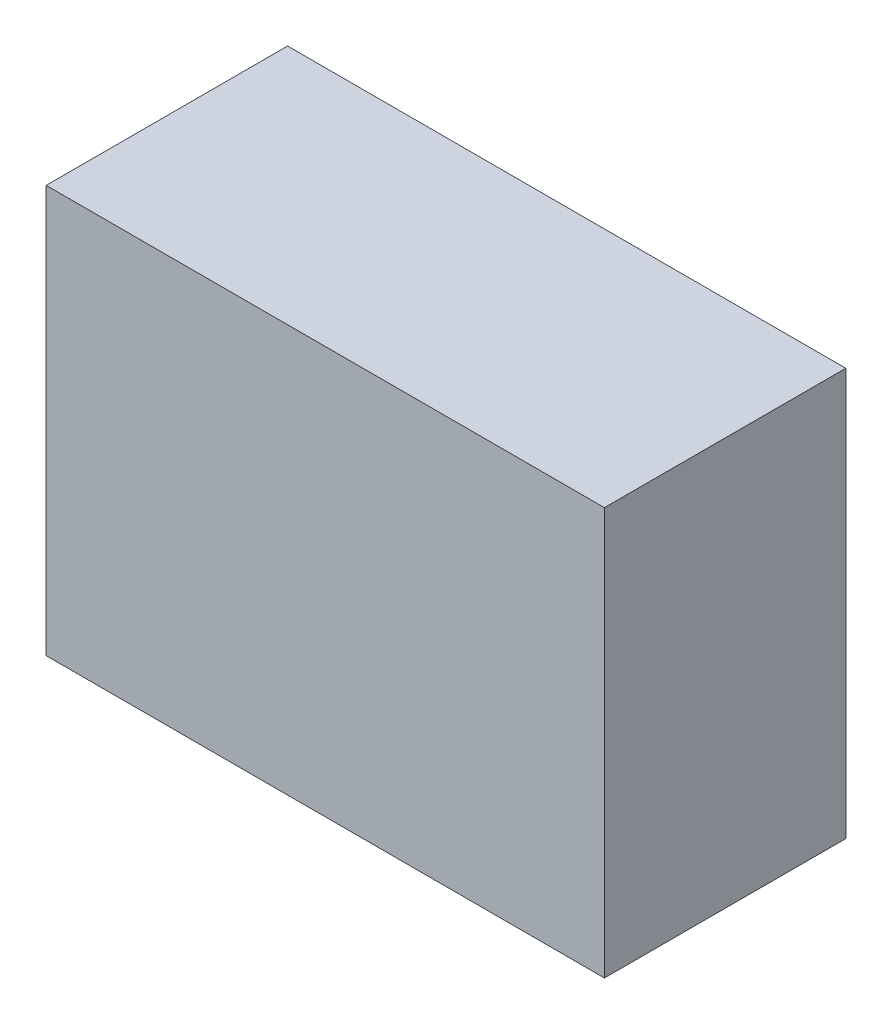
ISO-10303-21;
HEADER;
FILE_DESCRIPTION(('STEP AP214'),'2;1');
FILE_NAME('part.step','',(''),(''),'','','');
FILE_SCHEMA(('AUTOMOTIVE_DESIGN { 1 0 10303 214 1 1 1 1 }'));
ENDSEC;
DATA;
#1=APPLICATION_CONTEXT('core data for automotive mechanical design processes');
#2=APPLICATION_PROTOCOL_DEFINITION('international standard','automotive_design',2000,#1);
#3=PRODUCT_CONTEXT('',#1,'mechanical');
#4=PRODUCT('Part','Part','',(#3));
#5=PRODUCT_RELATED_PRODUCT_CATEGORY('part','',(#4));
#6=PRODUCT_DEFINITION_FORMATION('','',#4);
#7=PRODUCT_DEFINITION_CONTEXT('part definition',#1,'design');
#8=PRODUCT_DEFINITION('design','',#6,#7);
#9=PRODUCT_DEFINITION_SHAPE('','',#8);
#10=(LENGTH_UNIT() NAMED_UNIT(*) SI_UNIT(.MILLI.,.METRE.));
#11=(NAMED_UNIT(*) PLANE_ANGLE_UNIT() SI_UNIT($,.RADIAN.));
#12=(NAMED_UNIT(*) SI_UNIT($,.STERADIAN.) SOLID_ANGLE_UNIT());
#13=UNCERTAINTY_MEASURE_WITH_UNIT(LENGTH_MEASURE(1.E-05),#10,'distance_accuracy_value','');
#14=(GEOMETRIC_REPRESENTATION_CONTEXT(3) GLOBAL_UNCERTAINTY_ASSIGNED_CONTEXT((#13)) GLOBAL_UNIT_ASSIGNED_CONTEXT((#10,
#11,#12)) REPRESENTATION_CONTEXT('',''));
#15=CARTESIAN_POINT('',(0.,0.,0.));
#16=DIRECTION('',(0.,0.,1.));
#17=DIRECTION('',(1.,0.,0.));
#18=AXIS2_PLACEMENT_3D('',#15,#16,#17);
#19=CARTESIAN_POINT('',(0.,0.,16.));
#20=DIRECTION('',(1.,0.,0.));
#21=DIRECTION('',(0.,0.,-1.));
#22=AXIS2_PLACEMENT_3D('',#19,#20,#21);
#23=PLANE('',#22);
#24=DIRECTION('',(0.,-1.,0.));
#25=VECTOR('',#24,1.);
#26=CARTESIAN_POINT('',(0.,0.,0.));
#27=LINE('',#26,#25);
#28=CARTESIAN_POINT('',(0.,27.,0.));
#29=VERTEX_POINT('',#28);
#30=CARTESIAN_POINT('',(0.,0.,0.));
#31=VERTEX_POINT('',#30);
#32=EDGE_CURVE('E105',#29,#31,#27,.T.);
#33=ORIENTED_EDGE('',*,*,#32,.T.);
#34=DIRECTION('',(0.,0.,-1.));
#35=VECTOR('',#34,1.);
#36=CARTESIAN_POINT('',(0.,0.,16.));
#37=LINE('',#36,#35);
#38=CARTESIAN_POINT('',(0.,0.,16.));
#39=VERTEX_POINT('',#38);
#40=EDGE_CURVE('E11',#39,#31,#37,.T.);
#41=ORIENTED_EDGE('',*,*,#40,.F.);
#42=DIRECTION('',(0.,-1.,0.));
#43=VECTOR('',#42,1.);
#44=CARTESIAN_POINT('',(0.,0.,16.));
#45=LINE('',#44,#43);
#46=CARTESIAN_POINT('',(0.,27.,16.));
#47=VERTEX_POINT('',#46);
#48=EDGE_CURVE('E89',#47,#39,#45,.T.);
#49=ORIENTED_EDGE('',*,*,#48,.F.);
#50=DIRECTION('',(0.,0.,-1.));
#51=VECTOR('',#50,1.);
#52=CARTESIAN_POINT('',(0.,27.,16.));
#53=LINE('',#52,#51);
#54=EDGE_CURVE('E97',#47,#29,#53,.T.);
#55=ORIENTED_EDGE('',*,*,#54,.T.);
#56=EDGE_LOOP('',(#33,#41,#49,#55));
#57=FACE_BOUND('',#56,.T.);
#58=ADVANCED_FACE('F39',(#57),#23,.F.);
#59=CARTESIAN_POINT('',(0.,0.,16.));
#60=DIRECTION('',(0.,1.,0.));
#61=DIRECTION('',(0.,0.,1.));
#62=AXIS2_PLACEMENT_3D('',#59,#60,#61);
#63=PLANE('',#62);
#64=DIRECTION('',(1.,0.,0.));
#65=VECTOR('',#64,1.);
#66=CARTESIAN_POINT('',(0.,0.,0.));
#67=LINE('',#66,#65);
#68=CARTESIAN_POINT('',(37.,0.,0.));
#69=VERTEX_POINT('',#68);
#70=EDGE_CURVE('E92',#31,#69,#67,.T.);
#71=ORIENTED_EDGE('',*,*,#70,.T.);
#72=DIRECTION('',(0.,0.,-1.));
#73=VECTOR('',#72,1.);
#74=CARTESIAN_POINT('',(37.,0.,16.));
#75=LINE('',#74,#73);
#76=CARTESIAN_POINT('',(37.,0.,16.));
#77=VERTEX_POINT('',#76);
#78=EDGE_CURVE('E50',#77,#69,#75,.T.);
#79=ORIENTED_EDGE('',*,*,#78,.F.);
#80=DIRECTION('',(1.,0.,0.));
#81=VECTOR('',#80,1.);
#82=CARTESIAN_POINT('',(0.,0.,16.));
#83=LINE('',#82,#81);
#84=EDGE_CURVE('E82',#39,#77,#83,.T.);
#85=ORIENTED_EDGE('',*,*,#84,.F.);
#86=ORIENTED_EDGE('',*,*,#40,.T.);
#87=EDGE_LOOP('',(#71,#79,#85,#86));
#88=FACE_BOUND('',#87,.T.);
#89=ADVANCED_FACE('F93',(#88),#63,.F.);
#90=CARTESIAN_POINT('',(37.,0.,16.));
#91=DIRECTION('',(-1.,0.,0.));
#92=DIRECTION('',(0.,0.,1.));
#93=AXIS2_PLACEMENT_3D('',#90,#91,#92);
#94=PLANE('',#93);
#95=DIRECTION('',(0.,1.,0.));
#96=VECTOR('',#95,1.);
#97=CARTESIAN_POINT('',(37.,0.,0.));
#98=LINE('',#97,#96);
#99=CARTESIAN_POINT('',(37.,27.,0.));
#100=VERTEX_POINT('',#99);
#101=EDGE_CURVE('E72',#69,#100,#98,.T.);
#102=ORIENTED_EDGE('',*,*,#101,.T.);
#103=DIRECTION('',(0.,0.,-1.));
#104=VECTOR('',#103,1.);
#105=CARTESIAN_POINT('',(37.,27.,16.));
#106=LINE('',#105,#104);
#107=CARTESIAN_POINT('',(37.,27.,16.));
#108=VERTEX_POINT('',#107);
#109=EDGE_CURVE('E94',#108,#100,#106,.T.);
#110=ORIENTED_EDGE('',*,*,#109,.F.);
#111=DIRECTION('',(0.,1.,0.));
#112=VECTOR('',#111,1.);
#113=CARTESIAN_POINT('',(37.,0.,16.));
#114=LINE('',#113,#112);
#115=EDGE_CURVE('E88',#77,#108,#114,.T.);
#116=ORIENTED_EDGE('',*,*,#115,.F.);
#117=ORIENTED_EDGE('',*,*,#78,.T.);
#118=EDGE_LOOP('',(#102,#110,#116,#117));
#119=FACE_BOUND('',#118,.T.);
#120=ADVANCED_FACE('F96',(#119),#94,.F.);
#121=CARTESIAN_POINT('',(0.,27.,16.));
#122=DIRECTION('',(0.,-1.,0.));
#123=DIRECTION('',(0.,0.,-1.));
#124=AXIS2_PLACEMENT_3D('',#121,#122,#123);
#125=PLANE('',#124);
#126=DIRECTION('',(-1.,0.,0.));
#127=VECTOR('',#126,1.);
#128=CARTESIAN_POINT('',(0.,27.,0.));
#129=LINE('',#128,#127);
#130=EDGE_CURVE('E76',#100,#29,#129,.T.);
#131=ORIENTED_EDGE('',*,*,#130,.T.);
#132=ORIENTED_EDGE('',*,*,#54,.F.);
#133=DIRECTION('',(-1.,0.,0.));
#134=VECTOR('',#133,1.);
#135=CARTESIAN_POINT('',(0.,27.,16.));
#136=LINE('',#135,#134);
#137=EDGE_CURVE('E54',#108,#47,#136,.T.);
#138=ORIENTED_EDGE('',*,*,#137,.F.);
#139=ORIENTED_EDGE('',*,*,#109,.T.);
#140=EDGE_LOOP('',(#131,#132,#138,#139));
#141=FACE_BOUND('',#140,.T.);
#142=ADVANCED_FACE('F108',(#141),#125,.F.);
#143=CARTESIAN_POINT('',(0.,0.,16.));
#144=DIRECTION('',(0.,0.,-1.));
#145=DIRECTION('',(-1.,0.,0.));
#146=AXIS2_PLACEMENT_3D('',#143,#144,#145);
#147=PLANE('',#146);
#148=ORIENTED_EDGE('',*,*,#48,.T.);
#149=ORIENTED_EDGE('',*,*,#84,.T.);
#150=ORIENTED_EDGE('',*,*,#115,.T.);
#151=ORIENTED_EDGE('',*,*,#137,.T.);
#152=EDGE_LOOP('',(#148,#149,#150,#151));
#153=FACE_BOUND('',#152,.T.);
#154=ADVANCED_FACE('F86',(#153),#147,.F.);
#155=CARTESIAN_POINT('',(0.,0.,0.));
#156=DIRECTION('',(0.,0.,-1.));
#157=DIRECTION('',(-1.,0.,0.));
#158=AXIS2_PLACEMENT_3D('',#155,#156,#157);
#159=PLANE('',#158);
#160=ORIENTED_EDGE('',*,*,#32,.F.);
#161=ORIENTED_EDGE('',*,*,#130,.F.);
#162=ORIENTED_EDGE('',*,*,#101,.F.);
#163=ORIENTED_EDGE('',*,*,#70,.F.);
#164=EDGE_LOOP('',(#160,#161,#162,#163));
#165=FACE_BOUND('',#164,.T.);
#166=ADVANCED_FACE('F115',(#165),#159,.T.);
#167=CLOSED_SHELL('',(#58,#89,#120,#142,#154,#166));
#168=MANIFOLD_SOLID_BREP('B2',#167);
#169=ADVANCED_BREP_SHAPE_REPRESENTATION('',(#18,#168),#14);
#170=SHAPE_DEFINITION_REPRESENTATION(#9,#169);
ENDSEC;
END-ISO-10303-21;
